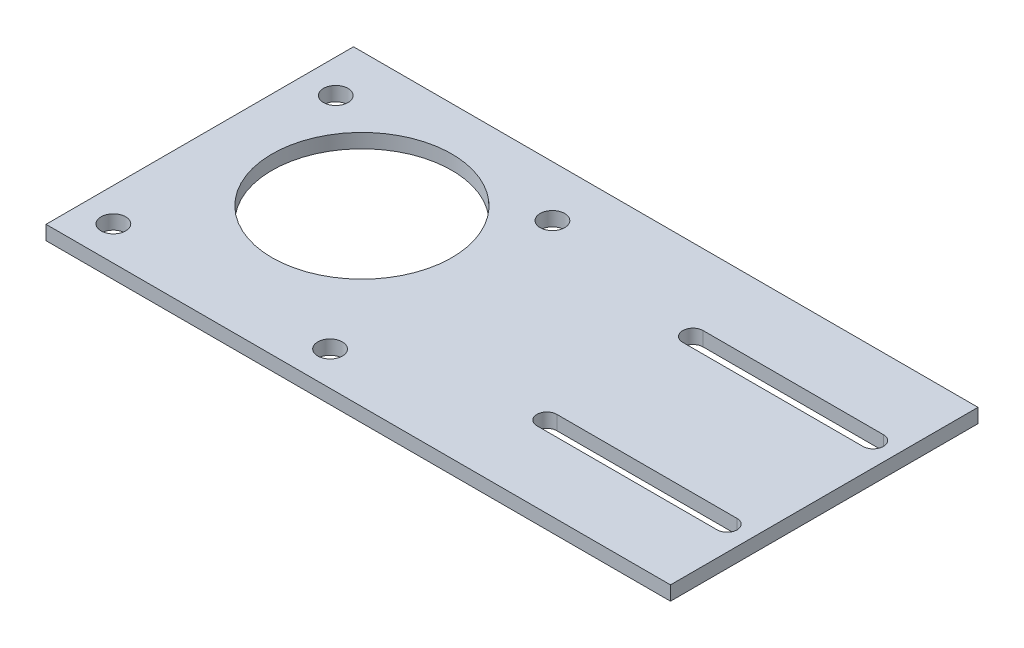
ISO-10303-21;
HEADER;
FILE_DESCRIPTION(('STEP AP214'),'2;1');
FILE_NAME('part.step','',(''),(''),'','','');
FILE_SCHEMA(('AUTOMOTIVE_DESIGN { 1 0 10303 214 1 1 1 1 }'));
ENDSEC;
DATA;
#1=APPLICATION_CONTEXT('core data for automotive mechanical design processes');
#2=APPLICATION_PROTOCOL_DEFINITION('international standard','automotive_design',2000,#1);
#3=PRODUCT_CONTEXT('',#1,'mechanical');
#4=PRODUCT('Part','Part','',(#3));
#5=PRODUCT_RELATED_PRODUCT_CATEGORY('part','',(#4));
#6=PRODUCT_DEFINITION_FORMATION('','',#4);
#7=PRODUCT_DEFINITION_CONTEXT('part definition',#1,'design');
#8=PRODUCT_DEFINITION('design','',#6,#7);
#9=PRODUCT_DEFINITION_SHAPE('','',#8);
#10=(LENGTH_UNIT() NAMED_UNIT(*) SI_UNIT(.MILLI.,.METRE.));
#11=(NAMED_UNIT(*) PLANE_ANGLE_UNIT() SI_UNIT($,.RADIAN.));
#12=(NAMED_UNIT(*) SI_UNIT($,.STERADIAN.) SOLID_ANGLE_UNIT());
#13=UNCERTAINTY_MEASURE_WITH_UNIT(LENGTH_MEASURE(1.E-05),#10,'distance_accuracy_value','');
#14=(GEOMETRIC_REPRESENTATION_CONTEXT(3) GLOBAL_UNCERTAINTY_ASSIGNED_CONTEXT((#13)) GLOBAL_UNIT_ASSIGNED_CONTEXT((#10,
#11,#12)) REPRESENTATION_CONTEXT('',''));
#15=CARTESIAN_POINT('',(0.,0.,0.));
#16=DIRECTION('',(0.,0.,1.));
#17=DIRECTION('',(1.,0.,0.));
#18=AXIS2_PLACEMENT_3D('',#15,#16,#17);
#19=CARTESIAN_POINT('',(-38.1136363636364,3.,-24.6704545454546));
#20=DIRECTION('',(1.,0.,0.));
#21=DIRECTION('',(0.,0.,-1.));
#22=AXIS2_PLACEMENT_3D('',#19,#20,#21);
#23=PLANE('',#22);
#24=DIRECTION('',(0.,0.,1.));
#25=VECTOR('',#24,1.);
#26=CARTESIAN_POINT('',(-38.1136363636364,0.,-24.6704545454546));
#27=LINE('',#26,#25);
#28=CARTESIAN_POINT('',(-38.1136363636364,0.,-24.6704545454546));
#29=VERTEX_POINT('',#28);
#30=CARTESIAN_POINT('',(-38.1136363636364,0.,40.3295454545454));
#31=VERTEX_POINT('',#30);
#32=EDGE_CURVE('E264',#29,#31,#27,.T.);
#33=ORIENTED_EDGE('',*,*,#32,.T.);
#34=DIRECTION('',(0.,-1.,0.));
#35=VECTOR('',#34,1.);
#36=CARTESIAN_POINT('',(-38.1136363636364,3.,40.3295454545454));
#37=LINE('',#36,#35);
#38=CARTESIAN_POINT('',(-38.1136363636364,3.,40.3295454545454));
#39=VERTEX_POINT('',#38);
#40=EDGE_CURVE('E11',#39,#31,#37,.T.);
#41=ORIENTED_EDGE('',*,*,#40,.F.);
#42=DIRECTION('',(0.,0.,1.));
#43=VECTOR('',#42,1.);
#44=CARTESIAN_POINT('',(-38.1136363636364,3.,-24.6704545454546));
#45=LINE('',#44,#43);
#46=CARTESIAN_POINT('',(-38.1136363636364,3.,-24.6704545454546));
#47=VERTEX_POINT('',#46);
#48=EDGE_CURVE('E268',#47,#39,#45,.T.);
#49=ORIENTED_EDGE('',*,*,#48,.F.);
#50=DIRECTION('',(0.,-1.,0.));
#51=VECTOR('',#50,1.);
#52=CARTESIAN_POINT('',(-38.1136363636364,3.,-24.6704545454546));
#53=LINE('',#52,#51);
#54=EDGE_CURVE('E282',#47,#29,#53,.T.);
#55=ORIENTED_EDGE('',*,*,#54,.T.);
#56=EDGE_LOOP('',(#33,#41,#49,#55));
#57=FACE_BOUND('',#56,.T.);
#58=ADVANCED_FACE('F45',(#57),#23,.F.);
#59=CARTESIAN_POINT('',(-38.1136363636364,3.,40.3295454545454));
#60=DIRECTION('',(0.,0.,-1.));
#61=DIRECTION('',(-1.,0.,0.));
#62=AXIS2_PLACEMENT_3D('',#59,#60,#61);
#63=PLANE('',#62);
#64=DIRECTION('',(1.,0.,0.));
#65=VECTOR('',#64,1.);
#66=CARTESIAN_POINT('',(-38.1136363636364,0.,40.3295454545454));
#67=LINE('',#66,#65);
#68=CARTESIAN_POINT('',(93.8863636363637,0.,40.3295454545454));
#69=VERTEX_POINT('',#68);
#70=EDGE_CURVE('E286',#31,#69,#67,.T.);
#71=ORIENTED_EDGE('',*,*,#70,.T.);
#72=DIRECTION('',(0.,-1.,0.));
#73=VECTOR('',#72,1.);
#74=CARTESIAN_POINT('',(93.8863636363637,3.,40.3295454545454));
#75=LINE('',#74,#73);
#76=CARTESIAN_POINT('',(93.8863636363637,3.,40.3295454545454));
#77=VERTEX_POINT('',#76);
#78=EDGE_CURVE('E53',#77,#69,#75,.T.);
#79=ORIENTED_EDGE('',*,*,#78,.F.);
#80=DIRECTION('',(1.,0.,0.));
#81=VECTOR('',#80,1.);
#82=CARTESIAN_POINT('',(-38.1136363636364,3.,40.3295454545454));
#83=LINE('',#82,#81);
#84=EDGE_CURVE('E272',#39,#77,#83,.T.);
#85=ORIENTED_EDGE('',*,*,#84,.F.);
#86=ORIENTED_EDGE('',*,*,#40,.T.);
#87=EDGE_LOOP('',(#71,#79,#85,#86));
#88=FACE_BOUND('',#87,.T.);
#89=ADVANCED_FACE('F321',(#88),#63,.F.);
#90=CARTESIAN_POINT('',(93.8863636363637,3.,-24.6704545454546));
#91=DIRECTION('',(-1.,0.,0.));
#92=DIRECTION('',(0.,0.,1.));
#93=AXIS2_PLACEMENT_3D('',#90,#91,#92);
#94=PLANE('',#93);
#95=DIRECTION('',(0.,0.,-1.));
#96=VECTOR('',#95,1.);
#97=CARTESIAN_POINT('',(93.8863636363637,0.,-24.6704545454546));
#98=LINE('',#97,#96);
#99=CARTESIAN_POINT('',(93.8863636363637,0.,-24.6704545454546));
#100=VERTEX_POINT('',#99);
#101=EDGE_CURVE('E289',#69,#100,#98,.T.);
#102=ORIENTED_EDGE('',*,*,#101,.T.);
#103=DIRECTION('',(0.,-1.,0.));
#104=VECTOR('',#103,1.);
#105=CARTESIAN_POINT('',(93.8863636363637,3.,-24.6704545454546));
#106=LINE('',#105,#104);
#107=CARTESIAN_POINT('',(93.8863636363637,3.,-24.6704545454546));
#108=VERTEX_POINT('',#107);
#109=EDGE_CURVE('E297',#108,#100,#106,.T.);
#110=ORIENTED_EDGE('',*,*,#109,.F.);
#111=DIRECTION('',(0.,0.,-1.));
#112=VECTOR('',#111,1.);
#113=CARTESIAN_POINT('',(93.8863636363637,3.,-24.6704545454546));
#114=LINE('',#113,#112);
#115=EDGE_CURVE('E276',#77,#108,#114,.T.);
#116=ORIENTED_EDGE('',*,*,#115,.F.);
#117=ORIENTED_EDGE('',*,*,#78,.T.);
#118=EDGE_LOOP('',(#102,#110,#116,#117));
#119=FACE_BOUND('',#118,.T.);
#120=ADVANCED_FACE('F306',(#119),#94,.F.);
#121=CARTESIAN_POINT('',(-38.1136363636364,3.,-24.6704545454546));
#122=DIRECTION('',(0.,0.,1.));
#123=DIRECTION('',(1.,0.,0.));
#124=AXIS2_PLACEMENT_3D('',#121,#122,#123);
#125=PLANE('',#124);
#126=DIRECTION('',(-1.,0.,0.));
#127=VECTOR('',#126,1.);
#128=CARTESIAN_POINT('',(-38.1136363636364,0.,-24.6704545454546));
#129=LINE('',#128,#127);
#130=EDGE_CURVE('E273',#100,#29,#129,.T.);
#131=ORIENTED_EDGE('',*,*,#130,.T.);
#132=ORIENTED_EDGE('',*,*,#54,.F.);
#133=DIRECTION('',(-1.,0.,0.));
#134=VECTOR('',#133,1.);
#135=CARTESIAN_POINT('',(-38.1136363636364,3.,-24.6704545454546));
#136=LINE('',#135,#134);
#137=EDGE_CURVE('E279',#108,#47,#136,.T.);
#138=ORIENTED_EDGE('',*,*,#137,.F.);
#139=ORIENTED_EDGE('',*,*,#109,.T.);
#140=EDGE_LOOP('',(#131,#132,#138,#139));
#141=FACE_BOUND('',#140,.T.);
#142=ADVANCED_FACE('F314',(#141),#125,.F.);
#143=CARTESIAN_POINT('',(0.,3.,0.));
#144=DIRECTION('',(0.,1.,0.));
#145=DIRECTION('',(0.,0.,1.));
#146=AXIS2_PLACEMENT_3D('',#143,#144,#145);
#147=PLANE('',#146);
#148=CARTESIAN_POINT('',(50.7937863836201,3.,-7.51145454545458));
#149=DIRECTION('',(0.,1.,0.));
#150=DIRECTION('',(0.,0.,1.));
#151=AXIS2_PLACEMENT_3D('',#148,#149,#150);
#152=CIRCLE('',#151,2.159);
#153=CARTESIAN_POINT('',(50.7937863836201,3.,-9.67045454545458));
#154=VERTEX_POINT('',#153);
#155=CARTESIAN_POINT('',(50.7937863836201,3.,-5.35245454545458));
#156=VERTEX_POINT('',#155);
#157=EDGE_CURVE('E60',#154,#156,#152,.T.);
#158=ORIENTED_EDGE('',*,*,#157,.F.);
#159=DIRECTION('',(-1.,0.,0.));
#160=VECTOR('',#159,1.);
#161=CARTESIAN_POINT('',(50.7937863836201,3.,-9.67045454545458));
#162=LINE('',#161,#160);
#163=CARTESIAN_POINT('',(88.8937863836201,3.,-9.67045454545457));
#164=VERTEX_POINT('',#163);
#165=EDGE_CURVE('E158',#164,#154,#162,.T.);
#166=ORIENTED_EDGE('',*,*,#165,.F.);
#167=CARTESIAN_POINT('',(88.8937863836201,3.,-7.51145454545457));
#168=DIRECTION('',(0.,1.,0.));
#169=DIRECTION('',(0.,0.,1.));
#170=AXIS2_PLACEMENT_3D('',#167,#168,#169);
#171=CIRCLE('',#170,2.159);
#172=CARTESIAN_POINT('',(88.8937863836201,3.,-5.35245454545457));
#173=VERTEX_POINT('',#172);
#174=EDGE_CURVE('E162',#173,#164,#171,.T.);
#175=ORIENTED_EDGE('',*,*,#174,.F.);
#176=DIRECTION('',(1.,0.,0.));
#177=VECTOR('',#176,1.);
#178=CARTESIAN_POINT('',(50.7937863836201,3.,-5.35245454545458));
#179=LINE('',#178,#177);
#180=EDGE_CURVE('E171',#156,#173,#179,.T.);
#181=ORIENTED_EDGE('',*,*,#180,.F.);
#182=EDGE_LOOP('',(#158,#166,#175,#181));
#183=FACE_BOUND('',#182,.T.);
#184=CARTESIAN_POINT('',(50.6585240241202,3.,23.2295454545454));
#185=DIRECTION('',(0.,1.,0.));
#186=DIRECTION('',(0.,0.,1.));
#187=AXIS2_PLACEMENT_3D('',#184,#185,#186);
#188=CIRCLE('',#187,2.1);
#189=CARTESIAN_POINT('',(50.6585240241202,3.,21.1295454545454));
#190=VERTEX_POINT('',#189);
#191=CARTESIAN_POINT('',(50.6585240241202,3.,25.3295454545454));
#192=VERTEX_POINT('',#191);
#193=EDGE_CURVE('E68',#190,#192,#188,.T.);
#194=ORIENTED_EDGE('',*,*,#193,.F.);
#195=DIRECTION('',(-1.,0.,0.));
#196=VECTOR('',#195,1.);
#197=CARTESIAN_POINT('',(50.6585240241202,3.,21.1295454545454));
#198=LINE('',#197,#196);
#199=CARTESIAN_POINT('',(88.7585240241202,3.,21.1295454545454));
#200=VERTEX_POINT('',#199);
#201=EDGE_CURVE('E199',#200,#190,#198,.T.);
#202=ORIENTED_EDGE('',*,*,#201,.F.);
#203=CARTESIAN_POINT('',(88.7585240241202,3.,23.2295454545454));
#204=DIRECTION('',(0.,1.,0.));
#205=DIRECTION('',(0.,0.,1.));
#206=AXIS2_PLACEMENT_3D('',#203,#204,#205);
#207=CIRCLE('',#206,2.1);
#208=CARTESIAN_POINT('',(88.7585240241202,3.,25.3295454545454));
#209=VERTEX_POINT('',#208);
#210=EDGE_CURVE('E203',#209,#200,#207,.T.);
#211=ORIENTED_EDGE('',*,*,#210,.F.);
#212=DIRECTION('',(1.,0.,0.));
#213=VECTOR('',#212,1.);
#214=CARTESIAN_POINT('',(50.6585240241202,3.,25.3295454545454));
#215=LINE('',#214,#213);
#216=EDGE_CURVE('E208',#192,#209,#215,.T.);
#217=ORIENTED_EDGE('',*,*,#216,.F.);
#218=EDGE_LOOP('',(#194,#202,#211,#217));
#219=FACE_BOUND('',#218,.T.);
#220=CARTESIAN_POINT('',(14.7257399373369,3.,33.1230828707596));
#221=DIRECTION('',(0.,1.,0.));
#222=DIRECTION('',(0.,0.,1.));
#223=AXIS2_PLACEMENT_3D('',#220,#221,#222);
#224=CIRCLE('',#223,2.6);
#225=CARTESIAN_POINT('',(14.7257399373369,3.,35.7230828707596));
#226=VERTEX_POINT('',#225);
#227=EDGE_CURVE('E253',#226,#226,#224,.T.);
#228=ORIENTED_EDGE('',*,*,#227,.F.);
#229=EDGE_LOOP('',(#228));
#230=FACE_BOUND('',#229,.T.);
#231=CARTESIAN_POINT('',(14.7257399373369,3.,-13.8769171292404));
#232=DIRECTION('',(0.,1.,0.));
#233=DIRECTION('',(0.,0.,1.));
#234=AXIS2_PLACEMENT_3D('',#231,#232,#233);
#235=CIRCLE('',#234,2.6);
#236=CARTESIAN_POINT('',(14.7257399373369,3.,-11.2769171292404));
#237=VERTEX_POINT('',#236);
#238=EDGE_CURVE('E245',#237,#237,#235,.T.);
#239=ORIENTED_EDGE('',*,*,#238,.F.);
#240=EDGE_LOOP('',(#239));
#241=FACE_BOUND('',#240,.T.);
#242=CARTESIAN_POINT('',(-31.0764504673121,3.,33.1230828707596));
#243=DIRECTION('',(0.,1.,0.));
#244=DIRECTION('',(0.,0.,1.));
#245=AXIS2_PLACEMENT_3D('',#242,#243,#244);
#246=CIRCLE('',#245,2.6);
#247=CARTESIAN_POINT('',(-31.0764504673121,3.,35.7230828707596));
#248=VERTEX_POINT('',#247);
#249=EDGE_CURVE('E237',#248,#248,#246,.T.);
#250=ORIENTED_EDGE('',*,*,#249,.F.);
#251=EDGE_LOOP('',(#250));
#252=FACE_BOUND('',#251,.T.);
#253=CARTESIAN_POINT('',(-31.0764504673121,3.,-13.8769171292404));
#254=DIRECTION('',(0.,1.,0.));
#255=DIRECTION('',(0.,0.,1.));
#256=AXIS2_PLACEMENT_3D('',#253,#254,#255);
#257=CIRCLE('',#256,2.6);
#258=CARTESIAN_POINT('',(-31.0764504673121,3.,-11.2769171292404));
#259=VERTEX_POINT('',#258);
#260=EDGE_CURVE('E228',#259,#259,#257,.T.);
#261=ORIENTED_EDGE('',*,*,#260,.F.);
#262=EDGE_LOOP('',(#261));
#263=FACE_BOUND('',#262,.T.);
#264=CARTESIAN_POINT('',(-8.11363636363635,3.,3.55501502451915));
#265=DIRECTION('',(0.,1.,0.));
#266=DIRECTION('',(0.,0.,1.));
#267=AXIS2_PLACEMENT_3D('',#264,#265,#266);
#268=CIRCLE('',#267,19.);
#269=CARTESIAN_POINT('',(-8.11363636363635,3.,22.5550150245192));
#270=VERTEX_POINT('',#269);
#271=EDGE_CURVE('E232',#270,#270,#268,.T.);
#272=ORIENTED_EDGE('',*,*,#271,.F.);
#273=EDGE_LOOP('',(#272));
#274=FACE_BOUND('',#273,.T.);
#275=ORIENTED_EDGE('',*,*,#48,.T.);
#276=ORIENTED_EDGE('',*,*,#84,.T.);
#277=ORIENTED_EDGE('',*,*,#115,.T.);
#278=ORIENTED_EDGE('',*,*,#137,.T.);
#279=EDGE_LOOP('',(#275,#276,#277,#278));
#280=FACE_BOUND('',#279,.T.);
#281=ADVANCED_FACE('F320',(#183,#219,#230,#241,#252,#263,#274,#280),#147,.T.);
#282=CARTESIAN_POINT('',(0.,0.,0.));
#283=DIRECTION('',(0.,1.,0.));
#284=DIRECTION('',(0.,0.,1.));
#285=AXIS2_PLACEMENT_3D('',#282,#283,#284);
#286=PLANE('',#285);
#287=DIRECTION('',(-1.,0.,0.));
#288=VECTOR('',#287,1.);
#289=CARTESIAN_POINT('',(50.7937863836201,0.,-9.67045454545458));
#290=LINE('',#289,#288);
#291=CARTESIAN_POINT('',(88.8937863836201,0.,-9.67045454545457));
#292=VERTEX_POINT('',#291);
#293=CARTESIAN_POINT('',(50.7937863836201,0.,-9.67045454545458));
#294=VERTEX_POINT('',#293);
#295=EDGE_CURVE('E143',#292,#294,#290,.T.);
#296=ORIENTED_EDGE('',*,*,#295,.T.);
#297=CARTESIAN_POINT('',(50.7937863836201,0.,-7.51145454545458));
#298=DIRECTION('',(0.,1.,0.));
#299=DIRECTION('',(0.,0.,1.));
#300=AXIS2_PLACEMENT_3D('',#297,#298,#299);
#301=CIRCLE('',#300,2.159);
#302=CARTESIAN_POINT('',(50.7937863836201,0.,-5.35245454545458));
#303=VERTEX_POINT('',#302);
#304=EDGE_CURVE('E136',#294,#303,#301,.T.);
#305=ORIENTED_EDGE('',*,*,#304,.T.);
#306=DIRECTION('',(1.,0.,0.));
#307=VECTOR('',#306,1.);
#308=CARTESIAN_POINT('',(50.7937863836201,0.,-5.35245454545458));
#309=LINE('',#308,#307);
#310=CARTESIAN_POINT('',(88.8937863836201,0.,-5.35245454545457));
#311=VERTEX_POINT('',#310);
#312=EDGE_CURVE('E147',#303,#311,#309,.T.);
#313=ORIENTED_EDGE('',*,*,#312,.T.);
#314=CARTESIAN_POINT('',(88.8937863836201,0.,-7.51145454545457));
#315=DIRECTION('',(0.,1.,0.));
#316=DIRECTION('',(0.,0.,1.));
#317=AXIS2_PLACEMENT_3D('',#314,#315,#316);
#318=CIRCLE('',#317,2.159);
#319=EDGE_CURVE('E152',#311,#292,#318,.T.);
#320=ORIENTED_EDGE('',*,*,#319,.T.);
#321=EDGE_LOOP('',(#296,#305,#313,#320));
#322=FACE_BOUND('',#321,.T.);
#323=DIRECTION('',(-1.,0.,0.));
#324=VECTOR('',#323,1.);
#325=CARTESIAN_POINT('',(50.6585240241202,0.,21.1295454545454));
#326=LINE('',#325,#324);
#327=CARTESIAN_POINT('',(88.7585240241202,0.,21.1295454545454));
#328=VERTEX_POINT('',#327);
#329=CARTESIAN_POINT('',(50.6585240241202,0.,21.1295454545454));
#330=VERTEX_POINT('',#329);
#331=EDGE_CURVE('E189',#328,#330,#326,.T.);
#332=ORIENTED_EDGE('',*,*,#331,.T.);
#333=CARTESIAN_POINT('',(50.6585240241202,0.,23.2295454545454));
#334=DIRECTION('',(0.,1.,0.));
#335=DIRECTION('',(0.,0.,1.));
#336=AXIS2_PLACEMENT_3D('',#333,#334,#335);
#337=CIRCLE('',#336,2.1);
#338=CARTESIAN_POINT('',(50.6585240241202,0.,25.3295454545454));
#339=VERTEX_POINT('',#338);
#340=EDGE_CURVE('E204',#330,#339,#337,.T.);
#341=ORIENTED_EDGE('',*,*,#340,.T.);
#342=DIRECTION('',(1.,0.,0.));
#343=VECTOR('',#342,1.);
#344=CARTESIAN_POINT('',(50.6585240241202,0.,25.3295454545454));
#345=LINE('',#344,#343);
#346=CARTESIAN_POINT('',(88.7585240241202,0.,25.3295454545454));
#347=VERTEX_POINT('',#346);
#348=EDGE_CURVE('E221',#339,#347,#345,.T.);
#349=ORIENTED_EDGE('',*,*,#348,.T.);
#350=CARTESIAN_POINT('',(88.7585240241202,0.,23.2295454545454));
#351=DIRECTION('',(0.,1.,0.));
#352=DIRECTION('',(0.,0.,1.));
#353=AXIS2_PLACEMENT_3D('',#350,#351,#352);
#354=CIRCLE('',#353,2.1);
#355=EDGE_CURVE('E217',#347,#328,#354,.T.);
#356=ORIENTED_EDGE('',*,*,#355,.T.);
#357=EDGE_LOOP('',(#332,#341,#349,#356));
#358=FACE_BOUND('',#357,.T.);
#359=CARTESIAN_POINT('',(14.7257399373369,0.,33.1230828707596));
#360=DIRECTION('',(0.,1.,0.));
#361=DIRECTION('',(0.,0.,1.));
#362=AXIS2_PLACEMENT_3D('',#359,#360,#361);
#363=CIRCLE('',#362,2.6);
#364=CARTESIAN_POINT('',(14.7257399373369,0.,35.7230828707596));
#365=VERTEX_POINT('',#364);
#366=EDGE_CURVE('E180',#365,#365,#363,.T.);
#367=ORIENTED_EDGE('',*,*,#366,.T.);
#368=EDGE_LOOP('',(#367));
#369=FACE_BOUND('',#368,.T.);
#370=CARTESIAN_POINT('',(14.7257399373369,0.,-13.8769171292404));
#371=DIRECTION('',(0.,1.,0.));
#372=DIRECTION('',(0.,0.,1.));
#373=AXIS2_PLACEMENT_3D('',#370,#371,#372);
#374=CIRCLE('',#373,2.6);
#375=CARTESIAN_POINT('',(14.7257399373369,0.,-11.2769171292404));
#376=VERTEX_POINT('',#375);
#377=EDGE_CURVE('E249',#376,#376,#374,.T.);
#378=ORIENTED_EDGE('',*,*,#377,.T.);
#379=EDGE_LOOP('',(#378));
#380=FACE_BOUND('',#379,.T.);
#381=CARTESIAN_POINT('',(-31.0764504673121,0.,33.1230828707596));
#382=DIRECTION('',(0.,1.,0.));
#383=DIRECTION('',(0.,0.,1.));
#384=AXIS2_PLACEMENT_3D('',#381,#382,#383);
#385=CIRCLE('',#384,2.6);
#386=CARTESIAN_POINT('',(-31.0764504673121,0.,35.7230828707596));
#387=VERTEX_POINT('',#386);
#388=EDGE_CURVE('E241',#387,#387,#385,.T.);
#389=ORIENTED_EDGE('',*,*,#388,.T.);
#390=EDGE_LOOP('',(#389));
#391=FACE_BOUND('',#390,.T.);
#392=CARTESIAN_POINT('',(-31.0764504673121,0.,-13.8769171292404));
#393=DIRECTION('',(0.,1.,0.));
#394=DIRECTION('',(0.,0.,1.));
#395=AXIS2_PLACEMENT_3D('',#392,#393,#394);
#396=CIRCLE('',#395,2.6);
#397=CARTESIAN_POINT('',(-31.0764504673121,0.,-11.2769171292404));
#398=VERTEX_POINT('',#397);
#399=EDGE_CURVE('E233',#398,#398,#396,.T.);
#400=ORIENTED_EDGE('',*,*,#399,.T.);
#401=EDGE_LOOP('',(#400));
#402=FACE_BOUND('',#401,.T.);
#403=CARTESIAN_POINT('',(-8.11363636363635,0.,3.55501502451915));
#404=DIRECTION('',(0.,1.,0.));
#405=DIRECTION('',(0.,0.,1.));
#406=AXIS2_PLACEMENT_3D('',#403,#404,#405);
#407=CIRCLE('',#406,19.);
#408=CARTESIAN_POINT('',(-8.11363636363635,0.,22.5550150245192));
#409=VERTEX_POINT('',#408);
#410=EDGE_CURVE('E260',#409,#409,#407,.T.);
#411=ORIENTED_EDGE('',*,*,#410,.T.);
#412=EDGE_LOOP('',(#411));
#413=FACE_BOUND('',#412,.T.);
#414=ORIENTED_EDGE('',*,*,#32,.F.);
#415=ORIENTED_EDGE('',*,*,#130,.F.);
#416=ORIENTED_EDGE('',*,*,#101,.F.);
#417=ORIENTED_EDGE('',*,*,#70,.F.);
#418=EDGE_LOOP('',(#414,#415,#416,#417));
#419=FACE_BOUND('',#418,.T.);
#420=ADVANCED_FACE('F154',(#322,#358,#369,#380,#391,#402,#413,#419),#286,.F.);
#421=CARTESIAN_POINT('',(-8.11363636363635,0.,3.55501502451915));
#422=DIRECTION('',(0.,1.,0.));
#423=DIRECTION('',(0.,0.,1.));
#424=AXIS2_PLACEMENT_3D('',#421,#422,#423);
#425=CYLINDRICAL_SURFACE('',#424,19.);
#426=ORIENTED_EDGE('',*,*,#410,.F.);
#427=EDGE_LOOP('',(#426));
#428=FACE_BOUND('',#427,.T.);
#429=ORIENTED_EDGE('',*,*,#271,.T.);
#430=EDGE_LOOP('',(#429));
#431=FACE_BOUND('',#430,.T.);
#432=ADVANCED_FACE('F333',(#428,#431),#425,.F.);
#433=CARTESIAN_POINT('',(-31.0764504673121,0.,-13.8769171292404));
#434=DIRECTION('',(0.,1.,0.));
#435=DIRECTION('',(0.,0.,1.));
#436=AXIS2_PLACEMENT_3D('',#433,#434,#435);
#437=CYLINDRICAL_SURFACE('',#436,2.6);
#438=ORIENTED_EDGE('',*,*,#399,.F.);
#439=EDGE_LOOP('',(#438));
#440=FACE_BOUND('',#439,.T.);
#441=ORIENTED_EDGE('',*,*,#260,.T.);
#442=EDGE_LOOP('',(#441));
#443=FACE_BOUND('',#442,.T.);
#444=ADVANCED_FACE('F339',(#440,#443),#437,.F.);
#445=CARTESIAN_POINT('',(-31.0764504673121,0.,33.1230828707596));
#446=DIRECTION('',(0.,1.,0.));
#447=DIRECTION('',(0.,0.,1.));
#448=AXIS2_PLACEMENT_3D('',#445,#446,#447);
#449=CYLINDRICAL_SURFACE('',#448,2.6);
#450=ORIENTED_EDGE('',*,*,#388,.F.);
#451=EDGE_LOOP('',(#450));
#452=FACE_BOUND('',#451,.T.);
#453=ORIENTED_EDGE('',*,*,#249,.T.);
#454=EDGE_LOOP('',(#453));
#455=FACE_BOUND('',#454,.T.);
#456=ADVANCED_FACE('F349',(#452,#455),#449,.F.);
#457=CARTESIAN_POINT('',(14.7257399373369,0.,-13.8769171292404));
#458=DIRECTION('',(0.,1.,0.));
#459=DIRECTION('',(0.,0.,1.));
#460=AXIS2_PLACEMENT_3D('',#457,#458,#459);
#461=CYLINDRICAL_SURFACE('',#460,2.6);
#462=ORIENTED_EDGE('',*,*,#377,.F.);
#463=EDGE_LOOP('',(#462));
#464=FACE_BOUND('',#463,.T.);
#465=ORIENTED_EDGE('',*,*,#238,.T.);
#466=EDGE_LOOP('',(#465));
#467=FACE_BOUND('',#466,.T.);
#468=ADVANCED_FACE('F345',(#464,#467),#461,.F.);
#469=CARTESIAN_POINT('',(14.7257399373369,0.,33.1230828707596));
#470=DIRECTION('',(0.,1.,0.));
#471=DIRECTION('',(0.,0.,1.));
#472=AXIS2_PLACEMENT_3D('',#469,#470,#471);
#473=CYLINDRICAL_SURFACE('',#472,2.6);
#474=ORIENTED_EDGE('',*,*,#366,.F.);
#475=EDGE_LOOP('',(#474));
#476=FACE_BOUND('',#475,.T.);
#477=ORIENTED_EDGE('',*,*,#227,.T.);
#478=EDGE_LOOP('',(#477));
#479=FACE_BOUND('',#478,.T.);
#480=ADVANCED_FACE('F341',(#476,#479),#473,.F.);
#481=CARTESIAN_POINT('',(50.6585240241202,0.,23.2295454545454));
#482=DIRECTION('',(0.,1.,0.));
#483=DIRECTION('',(0.,0.,1.));
#484=AXIS2_PLACEMENT_3D('',#481,#482,#483);
#485=CYLINDRICAL_SURFACE('',#484,2.1);
#486=ORIENTED_EDGE('',*,*,#193,.T.);
#487=DIRECTION('',(0.,1.,0.));
#488=VECTOR('',#487,1.);
#489=CARTESIAN_POINT('',(50.6585240241202,0.,25.3295454545454));
#490=LINE('',#489,#488);
#491=EDGE_CURVE('E186',#339,#192,#490,.T.);
#492=ORIENTED_EDGE('',*,*,#491,.F.);
#493=ORIENTED_EDGE('',*,*,#340,.F.);
#494=DIRECTION('',(0.,1.,0.));
#495=VECTOR('',#494,1.);
#496=CARTESIAN_POINT('',(50.6585240241202,0.,21.1295454545454));
#497=LINE('',#496,#495);
#498=EDGE_CURVE('E196',#330,#190,#497,.T.);
#499=ORIENTED_EDGE('',*,*,#498,.T.);
#500=EDGE_LOOP('',(#486,#492,#493,#499));
#501=FACE_BOUND('',#500,.T.);
#502=ADVANCED_FACE('F344',(#501),#485,.F.);
#503=CARTESIAN_POINT('',(50.6585240241202,0.,21.1295454545454));
#504=DIRECTION('',(0.,0.,-1.));
#505=DIRECTION('',(-1.,0.,0.));
#506=AXIS2_PLACEMENT_3D('',#503,#504,#505);
#507=PLANE('',#506);
#508=ORIENTED_EDGE('',*,*,#201,.T.);
#509=ORIENTED_EDGE('',*,*,#498,.F.);
#510=ORIENTED_EDGE('',*,*,#331,.F.);
#511=DIRECTION('',(0.,1.,0.));
#512=VECTOR('',#511,1.);
#513=CARTESIAN_POINT('',(88.7585240241202,0.,21.1295454545454));
#514=LINE('',#513,#512);
#515=EDGE_CURVE('E193',#328,#200,#514,.T.);
#516=ORIENTED_EDGE('',*,*,#515,.T.);
#517=EDGE_LOOP('',(#508,#509,#510,#516));
#518=FACE_BOUND('',#517,.T.);
#519=ADVANCED_FACE('F357',(#518),#507,.F.);
#520=CARTESIAN_POINT('',(88.7585240241202,0.,23.2295454545454));
#521=DIRECTION('',(0.,1.,0.));
#522=DIRECTION('',(0.,0.,1.));
#523=AXIS2_PLACEMENT_3D('',#520,#521,#522);
#524=CYLINDRICAL_SURFACE('',#523,2.1);
#525=ORIENTED_EDGE('',*,*,#210,.T.);
#526=ORIENTED_EDGE('',*,*,#515,.F.);
#527=ORIENTED_EDGE('',*,*,#355,.F.);
#528=DIRECTION('',(0.,1.,0.));
#529=VECTOR('',#528,1.);
#530=CARTESIAN_POINT('',(88.7585240241202,0.,25.3295454545454));
#531=LINE('',#530,#529);
#532=EDGE_CURVE('E190',#347,#209,#531,.T.);
#533=ORIENTED_EDGE('',*,*,#532,.T.);
#534=EDGE_LOOP('',(#525,#526,#527,#533));
#535=FACE_BOUND('',#534,.T.);
#536=ADVANCED_FACE('F360',(#535),#524,.F.);
#537=CARTESIAN_POINT('',(50.6585240241202,0.,25.3295454545454));
#538=DIRECTION('',(0.,0.,1.));
#539=DIRECTION('',(1.,0.,0.));
#540=AXIS2_PLACEMENT_3D('',#537,#538,#539);
#541=PLANE('',#540);
#542=ORIENTED_EDGE('',*,*,#216,.T.);
#543=ORIENTED_EDGE('',*,*,#532,.F.);
#544=ORIENTED_EDGE('',*,*,#348,.F.);
#545=ORIENTED_EDGE('',*,*,#491,.T.);
#546=EDGE_LOOP('',(#542,#543,#544,#545));
#547=FACE_BOUND('',#546,.T.);
#548=ADVANCED_FACE('F364',(#547),#541,.F.);
#549=CARTESIAN_POINT('',(50.7937863836201,0.,-7.51145454545458));
#550=DIRECTION('',(0.,1.,0.));
#551=DIRECTION('',(0.,0.,1.));
#552=AXIS2_PLACEMENT_3D('',#549,#550,#551);
#553=CYLINDRICAL_SURFACE('',#552,2.159);
#554=ORIENTED_EDGE('',*,*,#157,.T.);
#555=DIRECTION('',(0.,1.,0.));
#556=VECTOR('',#555,1.);
#557=CARTESIAN_POINT('',(50.7937863836201,0.,-5.35245454545458));
#558=LINE('',#557,#556);
#559=EDGE_CURVE('E132',#303,#156,#558,.T.);
#560=ORIENTED_EDGE('',*,*,#559,.F.);
#561=ORIENTED_EDGE('',*,*,#304,.F.);
#562=DIRECTION('',(0.,1.,0.));
#563=VECTOR('',#562,1.);
#564=CARTESIAN_POINT('',(50.7937863836201,0.,-9.67045454545458));
#565=LINE('',#564,#563);
#566=EDGE_CURVE('E177',#294,#154,#565,.T.);
#567=ORIENTED_EDGE('',*,*,#566,.T.);
#568=EDGE_LOOP('',(#554,#560,#561,#567));
#569=FACE_BOUND('',#568,.T.);
#570=ADVANCED_FACE('F134',(#569),#553,.F.);
#571=CARTESIAN_POINT('',(50.7937863836201,0.,-9.67045454545458));
#572=DIRECTION('',(0.,0.,-1.));
#573=DIRECTION('',(-1.,0.,0.));
#574=AXIS2_PLACEMENT_3D('',#571,#572,#573);
#575=PLANE('',#574);
#576=ORIENTED_EDGE('',*,*,#165,.T.);
#577=ORIENTED_EDGE('',*,*,#566,.F.);
#578=ORIENTED_EDGE('',*,*,#295,.F.);
#579=DIRECTION('',(0.,1.,0.));
#580=VECTOR('',#579,1.);
#581=CARTESIAN_POINT('',(88.8937863836201,0.,-9.67045454545457));
#582=LINE('',#581,#580);
#583=EDGE_CURVE('E181',#292,#164,#582,.T.);
#584=ORIENTED_EDGE('',*,*,#583,.T.);
#585=EDGE_LOOP('',(#576,#577,#578,#584));
#586=FACE_BOUND('',#585,.T.);
#587=ADVANCED_FACE('F373',(#586),#575,.F.);
#588=CARTESIAN_POINT('',(88.8937863836201,0.,-7.51145454545457));
#589=DIRECTION('',(0.,1.,0.));
#590=DIRECTION('',(0.,0.,1.));
#591=AXIS2_PLACEMENT_3D('',#588,#589,#590);
#592=CYLINDRICAL_SURFACE('',#591,2.159);
#593=ORIENTED_EDGE('',*,*,#174,.T.);
#594=ORIENTED_EDGE('',*,*,#583,.F.);
#595=ORIENTED_EDGE('',*,*,#319,.F.);
#596=DIRECTION('',(0.,1.,0.));
#597=VECTOR('',#596,1.);
#598=CARTESIAN_POINT('',(88.8937863836201,0.,-5.35245454545457));
#599=LINE('',#598,#597);
#600=EDGE_CURVE('E142',#311,#173,#599,.T.);
#601=ORIENTED_EDGE('',*,*,#600,.T.);
#602=EDGE_LOOP('',(#593,#594,#595,#601));
#603=FACE_BOUND('',#602,.T.);
#604=ADVANCED_FACE('F376',(#603),#592,.F.);
#605=CARTESIAN_POINT('',(50.7937863836201,0.,-5.35245454545458));
#606=DIRECTION('',(0.,0.,1.));
#607=DIRECTION('',(1.,0.,0.));
#608=AXIS2_PLACEMENT_3D('',#605,#606,#607);
#609=PLANE('',#608);
#610=ORIENTED_EDGE('',*,*,#180,.T.);
#611=ORIENTED_EDGE('',*,*,#600,.F.);
#612=ORIENTED_EDGE('',*,*,#312,.F.);
#613=ORIENTED_EDGE('',*,*,#559,.T.);
#614=EDGE_LOOP('',(#610,#611,#612,#613));
#615=FACE_BOUND('',#614,.T.);
#616=ADVANCED_FACE('F148',(#615),#609,.F.);
#617=CLOSED_SHELL('',(#58,#89,#120,#142,#281,#420,#432,#444,#456,#468,#480,#502,#519,#536,#548,
#570,#587,#604,#616));
#618=MANIFOLD_SOLID_BREP('B2',#617);
#619=ADVANCED_BREP_SHAPE_REPRESENTATION('',(#18,#618),#14);
#620=SHAPE_DEFINITION_REPRESENTATION(#9,#619);
ENDSEC;
END-ISO-10303-21;
